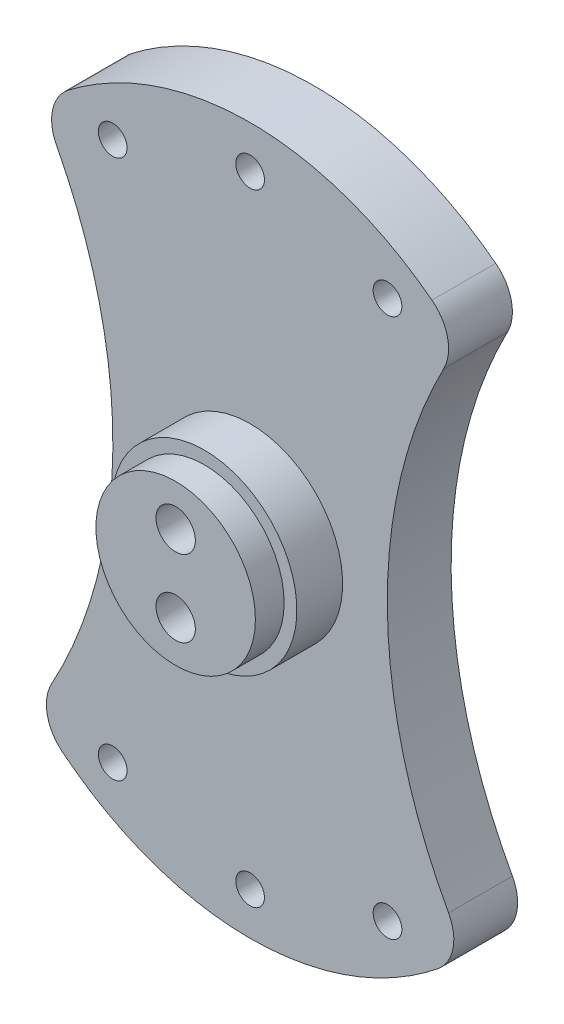
ISO-10303-21;
HEADER;
FILE_DESCRIPTION(('STEP AP214'),'2;1');
FILE_NAME('part.step','',(''),(''),'','','');
FILE_SCHEMA(('AUTOMOTIVE_DESIGN { 1 0 10303 214 1 1 1 1 }'));
ENDSEC;
DATA;
#1=APPLICATION_CONTEXT('core data for automotive mechanical design processes');
#2=APPLICATION_PROTOCOL_DEFINITION('international standard','automotive_design',2000,#1);
#3=PRODUCT_CONTEXT('',#1,'mechanical');
#4=PRODUCT('Part','Part','',(#3));
#5=PRODUCT_RELATED_PRODUCT_CATEGORY('part','',(#4));
#6=PRODUCT_DEFINITION_FORMATION('','',#4);
#7=PRODUCT_DEFINITION_CONTEXT('part definition',#1,'design');
#8=PRODUCT_DEFINITION('design','',#6,#7);
#9=PRODUCT_DEFINITION_SHAPE('','',#8);
#10=(LENGTH_UNIT() NAMED_UNIT(*) SI_UNIT(.MILLI.,.METRE.));
#11=(NAMED_UNIT(*) PLANE_ANGLE_UNIT() SI_UNIT($,.RADIAN.));
#12=(NAMED_UNIT(*) SI_UNIT($,.STERADIAN.) SOLID_ANGLE_UNIT());
#13=UNCERTAINTY_MEASURE_WITH_UNIT(LENGTH_MEASURE(1.E-05),#10,'distance_accuracy_value','');
#14=(GEOMETRIC_REPRESENTATION_CONTEXT(3) GLOBAL_UNCERTAINTY_ASSIGNED_CONTEXT((#13)) GLOBAL_UNIT_ASSIGNED_CONTEXT((#10,
#11,#12)) REPRESENTATION_CONTEXT('',''));
#15=CARTESIAN_POINT('',(0.,0.,0.));
#16=DIRECTION('',(0.,0.,1.));
#17=DIRECTION('',(1.,0.,0.));
#18=AXIS2_PLACEMENT_3D('',#15,#16,#17);
#19=CARTESIAN_POINT('',(0.,0.,6.));
#20=DIRECTION('',(0.,0.,1.));
#21=DIRECTION('',(1.,0.,0.));
#22=AXIS2_PLACEMENT_3D('',#19,#20,#21);
#23=PLANE('',#22);
#24=CARTESIAN_POINT('',(0.,-29.225,6.));
#25=DIRECTION('',(0.,0.,1.));
#26=DIRECTION('',(1.,0.,0.));
#27=AXIS2_PLACEMENT_3D('',#24,#25,#26);
#28=CIRCLE('',#27,1.35);
#29=CARTESIAN_POINT('',(1.35,-29.225,6.));
#30=VERTEX_POINT('',#29);
#31=EDGE_CURVE('E158',#30,#30,#28,.F.);
#32=ORIENTED_EDGE('',*,*,#31,.T.);
#33=EDGE_LOOP('',(#32));
#34=FACE_BOUND('',#33,.T.);
#35=CARTESIAN_POINT('',(12.9215543096716,-25.3599782356168,6.));
#36=DIRECTION('',(0.,0.,1.));
#37=DIRECTION('',(1.,0.,0.));
#38=AXIS2_PLACEMENT_3D('',#35,#36,#37);
#39=CIRCLE('',#38,1.35);
#40=CARTESIAN_POINT('',(14.2715543096716,-25.3599782356168,6.));
#41=VERTEX_POINT('',#40);
#42=EDGE_CURVE('E283',#41,#41,#39,.F.);
#43=ORIENTED_EDGE('',*,*,#42,.T.);
#44=EDGE_LOOP('',(#43));
#45=FACE_BOUND('',#44,.T.);
#46=CARTESIAN_POINT('',(12.9215543096716,25.3599782356168,6.));
#47=DIRECTION('',(0.,0.,1.));
#48=DIRECTION('',(1.,0.,0.));
#49=AXIS2_PLACEMENT_3D('',#46,#47,#48);
#50=CIRCLE('',#49,1.35);
#51=CARTESIAN_POINT('',(14.2715543096716,25.3599782356168,6.));
#52=VERTEX_POINT('',#51);
#53=EDGE_CURVE('E280',#52,#52,#50,.T.);
#54=ORIENTED_EDGE('',*,*,#53,.F.);
#55=EDGE_LOOP('',(#54));
#56=FACE_BOUND('',#55,.T.);
#57=CARTESIAN_POINT('',(0.,29.225,6.));
#58=DIRECTION('',(0.,0.,1.));
#59=DIRECTION('',(1.,0.,0.));
#60=AXIS2_PLACEMENT_3D('',#57,#58,#59);
#61=CIRCLE('',#60,1.35);
#62=CARTESIAN_POINT('',(1.35,29.225,6.));
#63=VERTEX_POINT('',#62);
#64=EDGE_CURVE('E267',#63,#63,#61,.T.);
#65=ORIENTED_EDGE('',*,*,#64,.F.);
#66=EDGE_LOOP('',(#65));
#67=FACE_BOUND('',#66,.T.);
#68=CARTESIAN_POINT('',(-12.9215543096716,-25.3599782356168,6.));
#69=DIRECTION('',(0.,0.,1.));
#70=DIRECTION('',(1.,0.,0.));
#71=AXIS2_PLACEMENT_3D('',#68,#69,#70);
#72=CIRCLE('',#71,1.35);
#73=CARTESIAN_POINT('',(-11.5715543096716,-25.3599782356168,6.));
#74=VERTEX_POINT('',#73);
#75=EDGE_CURVE('E202',#74,#74,#72,.F.);
#76=ORIENTED_EDGE('',*,*,#75,.T.);
#77=EDGE_LOOP('',(#76));
#78=FACE_BOUND('',#77,.T.);
#79=CARTESIAN_POINT('',(-59.6118557648063,0.652562466437344,6.));
#80=DIRECTION('',(0.,0.,1.));
#81=DIRECTION('',(1.,0.,0.));
#82=AXIS2_PLACEMENT_3D('',#79,#80,#81);
#83=CIRCLE('',#82,46.7074816018888);
#84=CARTESIAN_POINT('',(-18.2120138586179,22.2775925874196,6.));
#85=VERTEX_POINT('',#84);
#86=CARTESIAN_POINT('',(-18.6651096763802,-21.8185928745938,6.));
#87=VERTEX_POINT('',#86);
#88=EDGE_CURVE('E191',#85,#87,#83,.F.);
#89=ORIENTED_EDGE('',*,*,#88,.T.);
#90=CARTESIAN_POINT('',(-15.1584555229891,-23.7430087985833,6.));
#91=DIRECTION('',(0.,0.,1.));
#92=DIRECTION('',(1.,0.,0.));
#93=AXIS2_PLACEMENT_3D('',#90,#91,#92);
#94=CIRCLE('',#93,4.);
#95=CARTESIAN_POINT('',(-17.6669110775991,-26.8587191077337,6.));
#96=VERTEX_POINT('',#95);
#97=EDGE_CURVE('E172',#87,#96,#94,.T.);
#98=ORIENTED_EDGE('',*,*,#97,.T.);
#99=CARTESIAN_POINT('',(0.,33.225,6.));
#100=CARTESIAN_POINT('',(-3.89805562644198,33.225,6.));
#101=CARTESIAN_POINT('',(-11.6941668793259,31.5256911473883,6.));
#102=CARTESIAN_POINT('',(-21.6921982617657,24.202827109997,6.));
#103=CARTESIAN_POINT('',(-28.4372058259075,13.1331366522399,6.));
#104=CARTESIAN_POINT('',(-30.8188970870462,0.,6.));
#105=CARTESIAN_POINT('',(-28.4372058259075,-13.1331366522399,6.));
#106=CARTESIAN_POINT('',(-21.6921982617657,-24.202827109997,6.));
#107=CARTESIAN_POINT('',(-11.6941668793259,-31.5256911473883,6.));
#108=CARTESIAN_POINT('',(0.,-34.0746544263059,6.));
#109=CARTESIAN_POINT('',(11.6941668793259,-31.5256911473883,6.));
#110=CARTESIAN_POINT('',(21.6921982617657,-24.202827109997,6.));
#111=CARTESIAN_POINT('',(28.4372058259075,-13.1331366522399,6.));
#112=CARTESIAN_POINT('',(30.8188970870462,0.,6.));
#113=CARTESIAN_POINT('',(28.4372058259075,13.1331366522399,6.));
#114=CARTESIAN_POINT('',(21.6921982617657,24.202827109997,6.));
#115=CARTESIAN_POINT('',(11.694166879326,31.5256911473883,6.));
#116=CARTESIAN_POINT('',(3.89805562644199,33.225,6.));
#117=CARTESIAN_POINT('',(0.,33.225,6.));
#118=B_SPLINE_CURVE_WITH_KNOTS('',3,(#99,#100,#101,#102,#103,#104,#105,#106,#107,#108,#109,#110,
#111,#112,#113,#114,#115,#116,#117),.UNSPECIFIED.,.T.,.F.,(4,1,1,1,1,1,1,1,1,1,1,1,1,1,1,1,4),
(0.,0.392699081698724,0.785398163397448,1.17809724509617,1.5707963267949,1.96349540849362,
2.35619449019234,2.74889357189107,3.14159265358979,3.53429173528852,3.92699081698724,
4.31968989868597,4.71238898038469,5.10508806208341,5.49778714378214,5.89048622548086,
6.28318530717959),.UNSPECIFIED.);
#119=CARTESIAN_POINT('',(17.6669110775945,-26.8587191077375,6.));
#120=VERTEX_POINT('',#119);
#121=EDGE_CURVE('E121',#96,#120,#118,.T.);
#122=ORIENTED_EDGE('',*,*,#121,.T.);
#123=CARTESIAN_POINT('',(15.1584555229887,-23.7430087985836,6.));
#124=DIRECTION('',(0.,0.,1.));
#125=DIRECTION('',(1.,0.,0.));
#126=AXIS2_PLACEMENT_3D('',#123,#124,#125);
#127=CIRCLE('',#126,4.);
#128=CARTESIAN_POINT('',(18.6651096763799,-21.818592874594,6.));
#129=VERTEX_POINT('',#128);
#130=EDGE_CURVE('E170',#120,#129,#127,.T.);
#131=ORIENTED_EDGE('',*,*,#130,.T.);
#132=CARTESIAN_POINT('',(59.6118557648063,0.652562466437344,6.));
#133=DIRECTION('',(0.,0.,1.));
#134=DIRECTION('',(1.,0.,0.));
#135=AXIS2_PLACEMENT_3D('',#132,#133,#134);
#136=CIRCLE('',#135,46.7074816018892);
#137=CARTESIAN_POINT('',(18.2120138586175,22.2775925874199,6.));
#138=VERTEX_POINT('',#137);
#139=EDGE_CURVE('E193',#138,#129,#136,.T.);
#140=ORIENTED_EDGE('',*,*,#139,.F.);
#141=CARTESIAN_POINT('',(14.6665568580402,24.1295468679185,6.));
#142=DIRECTION('',(0.,0.,1.));
#143=DIRECTION('',(1.,0.,0.));
#144=AXIS2_PLACEMENT_3D('',#141,#142,#143);
#145=CIRCLE('',#144,4.);
#146=CARTESIAN_POINT('',(17.1006096224813,27.3037219008864,6.));
#147=VERTEX_POINT('',#146);
#148=EDGE_CURVE('E56',#138,#147,#145,.T.);
#149=ORIENTED_EDGE('',*,*,#148,.T.);
#150=CARTESIAN_POINT('',(-17.1006096224776,27.3037219008892,6.));
#151=VERTEX_POINT('',#150);
#152=EDGE_CURVE('E180',#147,#151,#118,.T.);
#153=ORIENTED_EDGE('',*,*,#152,.T.);
#154=CARTESIAN_POINT('',(-14.6665568580405,24.1295468679182,6.));
#155=DIRECTION('',(0.,0.,1.));
#156=DIRECTION('',(1.,0.,0.));
#157=AXIS2_PLACEMENT_3D('',#154,#155,#156);
#158=CIRCLE('',#157,4.);
#159=EDGE_CURVE('E168',#151,#85,#158,.T.);
#160=ORIENTED_EDGE('',*,*,#159,.T.);
#161=EDGE_LOOP('',(#89,#98,#122,#131,#140,#149,#153,#160));
#162=FACE_BOUND('',#161,.T.);
#163=CARTESIAN_POINT('',(-12.9215543096716,25.3599782356168,6.));
#164=DIRECTION('',(0.,0.,1.));
#165=DIRECTION('',(1.,0.,0.));
#166=AXIS2_PLACEMENT_3D('',#163,#164,#165);
#167=CIRCLE('',#166,1.35);
#168=CARTESIAN_POINT('',(-11.5715543096716,25.3599782356168,6.));
#169=VERTEX_POINT('',#168);
#170=EDGE_CURVE('E157',#169,#169,#167,.T.);
#171=ORIENTED_EDGE('',*,*,#170,.F.);
#172=EDGE_LOOP('',(#171));
#173=FACE_BOUND('',#172,.T.);
#174=CARTESIAN_POINT('',(0.,0.,6.));
#175=DIRECTION('',(0.,0.,1.));
#176=DIRECTION('',(1.,0.,0.));
#177=AXIS2_PLACEMENT_3D('',#174,#175,#176);
#178=CIRCLE('',#177,8.7);
#179=CARTESIAN_POINT('',(-8.7,0.,6.));
#180=VERTEX_POINT('',#179);
#181=EDGE_CURVE('E335',#180,#180,#178,.T.);
#182=ORIENTED_EDGE('',*,*,#181,.F.);
#183=EDGE_LOOP('',(#182));
#184=FACE_BOUND('',#183,.T.);
#185=ADVANCED_FACE('F36',(#34,#45,#56,#67,#78,#162,#173,#184),#23,.T.);
#186=CARTESIAN_POINT('',(-59.6118557648063,0.652562466437344,6.));
#187=DIRECTION('',(0.,0.,-1.));
#188=DIRECTION('',(-1.,0.,0.));
#189=AXIS2_PLACEMENT_3D('',#186,#187,#188);
#190=CYLINDRICAL_SURFACE('',#189,46.7074816018888);
#191=CARTESIAN_POINT('',(-59.6118557648063,0.652562466437344,0.));
#192=DIRECTION('',(0.,0.,1.));
#193=DIRECTION('',(1.,0.,0.));
#194=AXIS2_PLACEMENT_3D('',#191,#192,#193);
#195=CIRCLE('',#194,46.7074816018888);
#196=CARTESIAN_POINT('',(-18.2120138586179,22.2775925874196,0.));
#197=VERTEX_POINT('',#196);
#198=CARTESIAN_POINT('',(-18.6651096763802,-21.8185928745938,0.));
#199=VERTEX_POINT('',#198);
#200=EDGE_CURVE('E129',#197,#199,#195,.F.);
#201=ORIENTED_EDGE('',*,*,#200,.T.);
#202=DIRECTION('',(0.,0.,-1.));
#203=VECTOR('',#202,1.);
#204=CARTESIAN_POINT('',(-18.6651096763802,-21.8185928745938,6.));
#205=LINE('',#204,#203);
#206=EDGE_CURVE('E106',#199,#87,#205,.F.);
#207=ORIENTED_EDGE('',*,*,#206,.T.);
#208=ORIENTED_EDGE('',*,*,#88,.F.);
#209=DIRECTION('',(0.,0.,-1.));
#210=VECTOR('',#209,1.);
#211=CARTESIAN_POINT('',(-18.2120138586179,22.2775925874196,6.));
#212=LINE('',#211,#210);
#213=EDGE_CURVE('E111',#85,#197,#212,.T.);
#214=ORIENTED_EDGE('',*,*,#213,.T.);
#215=EDGE_LOOP('',(#201,#207,#208,#214));
#216=FACE_BOUND('',#215,.T.);
#217=ADVANCED_FACE('F189',(#216),#190,.F.);
#218=DIRECTION('',(0.,0.,-1.));
#219=VECTOR('',#218,1.);
#220=SURFACE_OF_LINEAR_EXTRUSION('',#118,#219);
#221=ORIENTED_EDGE('',*,*,#121,.F.);
#222=DIRECTION('',(0.,0.,-1.));
#223=VECTOR('',#222,1.);
#224=CARTESIAN_POINT('',(-17.6669110775948,-26.8587191077372,6.));
#225=LINE('',#224,#223);
#226=CARTESIAN_POINT('',(-17.6669110775948,-26.8587191077372,0.));
#227=VERTEX_POINT('',#226);
#228=EDGE_CURVE('E105',#96,#227,#225,.T.);
#229=ORIENTED_EDGE('',*,*,#228,.T.);
#230=CARTESIAN_POINT('',(0.,33.225,0.));
#231=CARTESIAN_POINT('',(-3.89805562644198,33.225,0.));
#232=CARTESIAN_POINT('',(-11.6941668793259,31.5256911473883,0.));
#233=CARTESIAN_POINT('',(-21.6921982617657,24.202827109997,0.));
#234=CARTESIAN_POINT('',(-28.4372058259075,13.1331366522399,0.));
#235=CARTESIAN_POINT('',(-30.8188970870462,0.,0.));
#236=CARTESIAN_POINT('',(-28.4372058259075,-13.1331366522399,0.));
#237=CARTESIAN_POINT('',(-21.6921982617657,-24.202827109997,0.));
#238=CARTESIAN_POINT('',(-11.6941668793259,-31.5256911473883,0.));
#239=CARTESIAN_POINT('',(0.,-34.0746544263059,0.));
#240=CARTESIAN_POINT('',(11.6941668793259,-31.5256911473883,0.));
#241=CARTESIAN_POINT('',(21.6921982617657,-24.202827109997,0.));
#242=CARTESIAN_POINT('',(28.4372058259075,-13.1331366522399,0.));
#243=CARTESIAN_POINT('',(30.8188970870462,0.,0.));
#244=CARTESIAN_POINT('',(28.4372058259075,13.1331366522399,0.));
#245=CARTESIAN_POINT('',(21.6921982617657,24.202827109997,0.));
#246=CARTESIAN_POINT('',(11.694166879326,31.5256911473883,0.));
#247=CARTESIAN_POINT('',(3.89805562644199,33.225,0.));
#248=CARTESIAN_POINT('',(0.,33.225,0.));
#249=B_SPLINE_CURVE_WITH_KNOTS('',3,(#230,#231,#232,#233,#234,#235,#236,#237,#238,#239,#240,
#241,#242,#243,#244,#245,#246,#247,#248),.UNSPECIFIED.,.T.,.F.,(4,1,1,1,1,1,1,1,1,1,1,1,1,1,1,1,
4),(0.,0.392699081698724,0.785398163397448,1.17809724509617,1.5707963267949,1.96349540849362,
2.35619449019234,2.74889357189107,3.14159265358979,3.53429173528852,3.92699081698724,
4.31968989868597,4.71238898038469,5.10508806208341,5.49778714378214,5.89048622548086,
6.28318530717959),.UNSPECIFIED.);
#250=CARTESIAN_POINT('',(17.6669110775945,-26.8587191077375,0.));
#251=VERTEX_POINT('',#250);
#252=EDGE_CURVE('E118',#227,#251,#249,.T.);
#253=ORIENTED_EDGE('',*,*,#252,.T.);
#254=DIRECTION('',(0.,0.,-1.));
#255=VECTOR('',#254,1.);
#256=CARTESIAN_POINT('',(17.6669110775945,-26.8587191077375,0.));
#257=LINE('',#256,#255);
#258=EDGE_CURVE('E123',#251,#120,#257,.F.);
#259=ORIENTED_EDGE('',*,*,#258,.T.);
#260=EDGE_LOOP('',(#221,#229,#253,#259));
#261=FACE_BOUND('',#260,.T.);
#262=ADVANCED_FACE('F117',(#261),#220,.F.);
#263=CARTESIAN_POINT('',(59.6118557648063,0.652562466437344,6.));
#264=DIRECTION('',(0.,0.,-1.));
#265=DIRECTION('',(-1.,0.,0.));
#266=AXIS2_PLACEMENT_3D('',#263,#264,#265);
#267=CYLINDRICAL_SURFACE('',#266,46.7074816018892);
#268=ORIENTED_EDGE('',*,*,#139,.T.);
#269=DIRECTION('',(0.,0.,-1.));
#270=VECTOR('',#269,1.);
#271=CARTESIAN_POINT('',(18.6651096763799,-21.818592874594,6.));
#272=LINE('',#271,#270);
#273=CARTESIAN_POINT('',(18.6651096763799,-21.818592874594,0.));
#274=VERTEX_POINT('',#273);
#275=EDGE_CURVE('E176',#129,#274,#272,.T.);
#276=ORIENTED_EDGE('',*,*,#275,.T.);
#277=CARTESIAN_POINT('',(59.6118557648063,0.652562466437344,0.));
#278=DIRECTION('',(0.,0.,1.));
#279=DIRECTION('',(1.,0.,0.));
#280=AXIS2_PLACEMENT_3D('',#277,#278,#279);
#281=CIRCLE('',#280,46.7074816018892);
#282=CARTESIAN_POINT('',(18.2120138586175,22.2775925874199,0.));
#283=VERTEX_POINT('',#282);
#284=EDGE_CURVE('E128',#283,#274,#281,.T.);
#285=ORIENTED_EDGE('',*,*,#284,.F.);
#286=DIRECTION('',(0.,0.,-1.));
#287=VECTOR('',#286,1.);
#288=CARTESIAN_POINT('',(18.2120138586175,22.2775925874199,6.));
#289=LINE('',#288,#287);
#290=EDGE_CURVE('E174',#283,#138,#289,.F.);
#291=ORIENTED_EDGE('',*,*,#290,.T.);
#292=EDGE_LOOP('',(#268,#276,#285,#291));
#293=FACE_BOUND('',#292,.T.);
#294=ADVANCED_FACE('F214',(#293),#267,.F.);
#295=CARTESIAN_POINT('',(12.9215543096716,-25.3599782356168,6.));
#296=DIRECTION('',(0.,0.,-1.));
#297=DIRECTION('',(-1.,0.,0.));
#298=AXIS2_PLACEMENT_3D('',#295,#296,#297);
#299=CYLINDRICAL_SURFACE('',#298,1.35);
#300=ORIENTED_EDGE('',*,*,#42,.F.);
#301=EDGE_LOOP('',(#300));
#302=FACE_BOUND('',#301,.T.);
#303=CARTESIAN_POINT('',(12.9215543096716,-25.3599782356168,0.));
#304=DIRECTION('',(0.,0.,1.));
#305=DIRECTION('',(1.,0.,0.));
#306=AXIS2_PLACEMENT_3D('',#303,#304,#305);
#307=CIRCLE('',#306,1.35);
#308=CARTESIAN_POINT('',(14.2715543096716,-25.3599782356168,0.));
#309=VERTEX_POINT('',#308);
#310=EDGE_CURVE('E151',#309,#309,#307,.F.);
#311=ORIENTED_EDGE('',*,*,#310,.T.);
#312=EDGE_LOOP('',(#311));
#313=FACE_BOUND('',#312,.T.);
#314=ADVANCED_FACE('F217',(#302,#313),#299,.F.);
#315=CARTESIAN_POINT('',(12.9215543096716,25.3599782356168,6.));
#316=DIRECTION('',(0.,0.,-1.));
#317=DIRECTION('',(-1.,0.,0.));
#318=AXIS2_PLACEMENT_3D('',#315,#316,#317);
#319=CYLINDRICAL_SURFACE('',#318,1.35);
#320=ORIENTED_EDGE('',*,*,#53,.T.);
#321=EDGE_LOOP('',(#320));
#322=FACE_BOUND('',#321,.T.);
#323=CARTESIAN_POINT('',(12.9215543096716,25.3599782356168,0.));
#324=DIRECTION('',(0.,0.,1.));
#325=DIRECTION('',(1.,0.,0.));
#326=AXIS2_PLACEMENT_3D('',#323,#324,#325);
#327=CIRCLE('',#326,1.35);
#328=CARTESIAN_POINT('',(14.2715543096716,25.3599782356168,0.));
#329=VERTEX_POINT('',#328);
#330=EDGE_CURVE('E146',#329,#329,#327,.T.);
#331=ORIENTED_EDGE('',*,*,#330,.F.);
#332=EDGE_LOOP('',(#331));
#333=FACE_BOUND('',#332,.T.);
#334=ADVANCED_FACE('F253',(#322,#333),#319,.F.);
#335=CARTESIAN_POINT('',(0.,29.225,6.));
#336=DIRECTION('',(0.,0.,-1.));
#337=DIRECTION('',(-1.,0.,0.));
#338=AXIS2_PLACEMENT_3D('',#335,#336,#337);
#339=CYLINDRICAL_SURFACE('',#338,1.35);
#340=ORIENTED_EDGE('',*,*,#64,.T.);
#341=EDGE_LOOP('',(#340));
#342=FACE_BOUND('',#341,.T.);
#343=CARTESIAN_POINT('',(0.,29.225,0.));
#344=DIRECTION('',(0.,0.,1.));
#345=DIRECTION('',(1.,0.,0.));
#346=AXIS2_PLACEMENT_3D('',#343,#344,#345);
#347=CIRCLE('',#346,1.35);
#348=CARTESIAN_POINT('',(1.35,29.225,0.));
#349=VERTEX_POINT('',#348);
#350=EDGE_CURVE('E141',#349,#349,#347,.T.);
#351=ORIENTED_EDGE('',*,*,#350,.F.);
#352=EDGE_LOOP('',(#351));
#353=FACE_BOUND('',#352,.T.);
#354=ADVANCED_FACE('F256',(#342,#353),#339,.F.);
#355=CARTESIAN_POINT('',(-12.9215543096716,-25.3599782356168,6.));
#356=DIRECTION('',(0.,0.,-1.));
#357=DIRECTION('',(-1.,0.,0.));
#358=AXIS2_PLACEMENT_3D('',#355,#356,#357);
#359=CYLINDRICAL_SURFACE('',#358,1.35);
#360=ORIENTED_EDGE('',*,*,#75,.F.);
#361=EDGE_LOOP('',(#360));
#362=FACE_BOUND('',#361,.T.);
#363=CARTESIAN_POINT('',(-12.9215543096716,-25.3599782356168,0.));
#364=DIRECTION('',(0.,0.,1.));
#365=DIRECTION('',(1.,0.,0.));
#366=AXIS2_PLACEMENT_3D('',#363,#364,#365);
#367=CIRCLE('',#366,1.35);
#368=CARTESIAN_POINT('',(-11.5715543096716,-25.3599782356168,0.));
#369=VERTEX_POINT('',#368);
#370=EDGE_CURVE('E137',#369,#369,#367,.F.);
#371=ORIENTED_EDGE('',*,*,#370,.T.);
#372=EDGE_LOOP('',(#371));
#373=FACE_BOUND('',#372,.T.);
#374=ADVANCED_FACE('F212',(#362,#373),#359,.F.);
#375=CARTESIAN_POINT('',(17.1006096224773,27.3037219008895,0.));
#376=VERTEX_POINT('',#375);
#377=CARTESIAN_POINT('',(-17.1006096224776,27.3037219008892,0.));
#378=VERTEX_POINT('',#377);
#379=EDGE_CURVE('E131',#376,#378,#249,.T.);
#380=ORIENTED_EDGE('',*,*,#379,.T.);
#381=DIRECTION('',(0.,0.,-1.));
#382=VECTOR('',#381,1.);
#383=CARTESIAN_POINT('',(-17.1006096224776,27.3037219008892,0.));
#384=LINE('',#383,#382);
#385=EDGE_CURVE('E11',#378,#151,#384,.F.);
#386=ORIENTED_EDGE('',*,*,#385,.T.);
#387=ORIENTED_EDGE('',*,*,#152,.F.);
#388=DIRECTION('',(0.,0.,-1.));
#389=VECTOR('',#388,1.);
#390=CARTESIAN_POINT('',(17.1006096224773,27.3037219008895,6.));
#391=LINE('',#390,#389);
#392=EDGE_CURVE('E44',#147,#376,#391,.T.);
#393=ORIENTED_EDGE('',*,*,#392,.T.);
#394=EDGE_LOOP('',(#380,#386,#387,#393));
#395=FACE_BOUND('',#394,.T.);
#396=ADVANCED_FACE('F179',(#395),#220,.F.);
#397=CARTESIAN_POINT('',(-12.9215543096716,25.3599782356168,6.));
#398=DIRECTION('',(0.,0.,-1.));
#399=DIRECTION('',(-1.,0.,0.));
#400=AXIS2_PLACEMENT_3D('',#397,#398,#399);
#401=CYLINDRICAL_SURFACE('',#400,1.35);
#402=ORIENTED_EDGE('',*,*,#170,.T.);
#403=EDGE_LOOP('',(#402));
#404=FACE_BOUND('',#403,.T.);
#405=CARTESIAN_POINT('',(-12.9215543096716,25.3599782356168,0.));
#406=DIRECTION('',(0.,0.,1.));
#407=DIRECTION('',(1.,0.,0.));
#408=AXIS2_PLACEMENT_3D('',#405,#406,#407);
#409=CIRCLE('',#408,1.35);
#410=CARTESIAN_POINT('',(-11.5715543096716,25.3599782356168,0.));
#411=VERTEX_POINT('',#410);
#412=EDGE_CURVE('E133',#411,#411,#409,.T.);
#413=ORIENTED_EDGE('',*,*,#412,.F.);
#414=EDGE_LOOP('',(#413));
#415=FACE_BOUND('',#414,.T.);
#416=ADVANCED_FACE('F211',(#404,#415),#401,.F.);
#417=CARTESIAN_POINT('',(0.,-29.225,6.));
#418=DIRECTION('',(0.,0.,-1.));
#419=DIRECTION('',(-1.,0.,0.));
#420=AXIS2_PLACEMENT_3D('',#417,#418,#419);
#421=CYLINDRICAL_SURFACE('',#420,1.35);
#422=ORIENTED_EDGE('',*,*,#31,.F.);
#423=EDGE_LOOP('',(#422));
#424=FACE_BOUND('',#423,.T.);
#425=CARTESIAN_POINT('',(0.,-29.225,0.));
#426=DIRECTION('',(0.,0.,1.));
#427=DIRECTION('',(1.,0.,0.));
#428=AXIS2_PLACEMENT_3D('',#425,#426,#427);
#429=CIRCLE('',#428,1.35);
#430=CARTESIAN_POINT('',(1.35,-29.225,0.));
#431=VERTEX_POINT('',#430);
#432=EDGE_CURVE('E154',#431,#431,#429,.F.);
#433=ORIENTED_EDGE('',*,*,#432,.T.);
#434=EDGE_LOOP('',(#433));
#435=FACE_BOUND('',#434,.T.);
#436=ADVANCED_FACE('F223',(#424,#435),#421,.F.);
#437=CARTESIAN_POINT('',(0.,0.,0.));
#438=DIRECTION('',(0.,0.,1.));
#439=DIRECTION('',(1.,0.,0.));
#440=AXIS2_PLACEMENT_3D('',#437,#438,#439);
#441=PLANE('',#440);
#442=CARTESIAN_POINT('',(-10.,0.,0.));
#443=DIRECTION('',(0.,0.,-1.));
#444=DIRECTION('',(-1.,0.,0.));
#445=AXIS2_PLACEMENT_3D('',#442,#443,#444);
#446=CIRCLE('',#445,2.1);
#447=CARTESIAN_POINT('',(-12.1,0.,0.));
#448=VERTEX_POINT('',#447);
#449=EDGE_CURVE('E330',#448,#448,#446,.T.);
#450=ORIENTED_EDGE('',*,*,#449,.F.);
#451=EDGE_LOOP('',(#450));
#452=FACE_BOUND('',#451,.T.);
#453=CARTESIAN_POINT('',(0.,-10.,0.));
#454=DIRECTION('',(0.,0.,-1.));
#455=DIRECTION('',(-1.,0.,0.));
#456=AXIS2_PLACEMENT_3D('',#453,#454,#455);
#457=CIRCLE('',#456,2.1);
#458=CARTESIAN_POINT('',(-2.1,-10.,0.));
#459=VERTEX_POINT('',#458);
#460=EDGE_CURVE('E324',#459,#459,#457,.T.);
#461=ORIENTED_EDGE('',*,*,#460,.F.);
#462=EDGE_LOOP('',(#461));
#463=FACE_BOUND('',#462,.T.);
#464=CARTESIAN_POINT('',(10.,0.,0.));
#465=DIRECTION('',(0.,0.,-1.));
#466=DIRECTION('',(-1.,0.,0.));
#467=AXIS2_PLACEMENT_3D('',#464,#465,#466);
#468=CIRCLE('',#467,2.1);
#469=CARTESIAN_POINT('',(7.9,0.,0.));
#470=VERTEX_POINT('',#469);
#471=EDGE_CURVE('E318',#470,#470,#468,.T.);
#472=ORIENTED_EDGE('',*,*,#471,.F.);
#473=EDGE_LOOP('',(#472));
#474=FACE_BOUND('',#473,.T.);
#475=CARTESIAN_POINT('',(0.,10.,0.));
#476=DIRECTION('',(0.,0.,-1.));
#477=DIRECTION('',(-1.,0.,0.));
#478=AXIS2_PLACEMENT_3D('',#475,#476,#477);
#479=CIRCLE('',#478,2.1);
#480=CARTESIAN_POINT('',(-2.1,10.,0.));
#481=VERTEX_POINT('',#480);
#482=EDGE_CURVE('E311',#481,#481,#479,.T.);
#483=ORIENTED_EDGE('',*,*,#482,.F.);
#484=EDGE_LOOP('',(#483));
#485=FACE_BOUND('',#484,.T.);
#486=CARTESIAN_POINT('',(0.,3.6,0.));
#487=DIRECTION('',(0.,0.,-1.));
#488=DIRECTION('',(-1.,0.,0.));
#489=AXIS2_PLACEMENT_3D('',#486,#487,#488);
#490=CIRCLE('',#489,1.85);
#491=CARTESIAN_POINT('',(-1.85,3.6,0.));
#492=VERTEX_POINT('',#491);
#493=EDGE_CURVE('E299',#492,#492,#490,.T.);
#494=ORIENTED_EDGE('',*,*,#493,.F.);
#495=EDGE_LOOP('',(#494));
#496=FACE_BOUND('',#495,.T.);
#497=CARTESIAN_POINT('',(0.,-3.6,0.));
#498=DIRECTION('',(0.,0.,-1.));
#499=DIRECTION('',(-1.,0.,0.));
#500=AXIS2_PLACEMENT_3D('',#497,#498,#499);
#501=CIRCLE('',#500,1.85);
#502=CARTESIAN_POINT('',(-1.85,-3.6,0.));
#503=VERTEX_POINT('',#502);
#504=EDGE_CURVE('E302',#503,#503,#501,.T.);
#505=ORIENTED_EDGE('',*,*,#504,.F.);
#506=EDGE_LOOP('',(#505));
#507=FACE_BOUND('',#506,.T.);
#508=ORIENTED_EDGE('',*,*,#412,.T.);
#509=EDGE_LOOP('',(#508));
#510=FACE_BOUND('',#509,.T.);
#511=ORIENTED_EDGE('',*,*,#252,.F.);
#512=CARTESIAN_POINT('',(-15.1584555229891,-23.7430087985833,0.));
#513=DIRECTION('',(0.,0.,1.));
#514=DIRECTION('',(1.,0.,0.));
#515=AXIS2_PLACEMENT_3D('',#512,#513,#514);
#516=CIRCLE('',#515,4.);
#517=EDGE_CURVE('E101',#227,#199,#516,.F.);
#518=ORIENTED_EDGE('',*,*,#517,.T.);
#519=ORIENTED_EDGE('',*,*,#200,.F.);
#520=CARTESIAN_POINT('',(-14.6665568580405,24.1295468679182,0.));
#521=DIRECTION('',(0.,0.,1.));
#522=DIRECTION('',(1.,0.,0.));
#523=AXIS2_PLACEMENT_3D('',#520,#521,#522);
#524=CIRCLE('',#523,4.);
#525=EDGE_CURVE('E161',#197,#378,#524,.F.);
#526=ORIENTED_EDGE('',*,*,#525,.T.);
#527=ORIENTED_EDGE('',*,*,#379,.F.);
#528=CARTESIAN_POINT('',(14.6665568580402,24.1295468679185,0.));
#529=DIRECTION('',(0.,0.,1.));
#530=DIRECTION('',(1.,0.,0.));
#531=AXIS2_PLACEMENT_3D('',#528,#529,#530);
#532=CIRCLE('',#531,4.);
#533=EDGE_CURVE('E122',#376,#283,#532,.F.);
#534=ORIENTED_EDGE('',*,*,#533,.T.);
#535=ORIENTED_EDGE('',*,*,#284,.T.);
#536=CARTESIAN_POINT('',(15.1584555229887,-23.7430087985836,0.));
#537=DIRECTION('',(0.,0.,1.));
#538=DIRECTION('',(1.,0.,0.));
#539=AXIS2_PLACEMENT_3D('',#536,#537,#538);
#540=CIRCLE('',#539,4.);
#541=EDGE_CURVE('E112',#274,#251,#540,.F.);
#542=ORIENTED_EDGE('',*,*,#541,.T.);
#543=EDGE_LOOP('',(#511,#518,#519,#526,#527,#534,#535,#542));
#544=FACE_BOUND('',#543,.T.);
#545=ORIENTED_EDGE('',*,*,#370,.F.);
#546=EDGE_LOOP('',(#545));
#547=FACE_BOUND('',#546,.T.);
#548=ORIENTED_EDGE('',*,*,#350,.T.);
#549=EDGE_LOOP('',(#548));
#550=FACE_BOUND('',#549,.T.);
#551=ORIENTED_EDGE('',*,*,#330,.T.);
#552=EDGE_LOOP('',(#551));
#553=FACE_BOUND('',#552,.T.);
#554=ORIENTED_EDGE('',*,*,#310,.F.);
#555=EDGE_LOOP('',(#554));
#556=FACE_BOUND('',#555,.T.);
#557=ORIENTED_EDGE('',*,*,#432,.F.);
#558=EDGE_LOOP('',(#557));
#559=FACE_BOUND('',#558,.T.);
#560=ADVANCED_FACE('F125',(#452,#463,#474,#485,#496,#507,#510,#544,#547,#550,#553,#556,#559),
#441,.F.);
#561=CARTESIAN_POINT('',(-15.1584555229891,-23.7430087985833,3.));
#562=DIRECTION('',(0.,0.,-1.));
#563=DIRECTION('',(-1.,0.,0.));
#564=AXIS2_PLACEMENT_3D('',#561,#562,#563);
#565=CYLINDRICAL_SURFACE('',#564,4.);
#566=ORIENTED_EDGE('',*,*,#97,.F.);
#567=ORIENTED_EDGE('',*,*,#206,.F.);
#568=ORIENTED_EDGE('',*,*,#517,.F.);
#569=ORIENTED_EDGE('',*,*,#228,.F.);
#570=EDGE_LOOP('',(#566,#567,#568,#569));
#571=FACE_BOUND('',#570,.T.);
#572=ADVANCED_FACE('F104',(#571),#565,.T.);
#573=CARTESIAN_POINT('',(15.1584555229887,-23.7430087985836,3.));
#574=DIRECTION('',(0.,0.,-1.));
#575=DIRECTION('',(-1.,0.,0.));
#576=AXIS2_PLACEMENT_3D('',#573,#574,#575);
#577=CYLINDRICAL_SURFACE('',#576,4.);
#578=ORIENTED_EDGE('',*,*,#130,.F.);
#579=ORIENTED_EDGE('',*,*,#258,.F.);
#580=ORIENTED_EDGE('',*,*,#541,.F.);
#581=ORIENTED_EDGE('',*,*,#275,.F.);
#582=EDGE_LOOP('',(#578,#579,#580,#581));
#583=FACE_BOUND('',#582,.T.);
#584=ADVANCED_FACE('F227',(#583),#577,.T.);
#585=CARTESIAN_POINT('',(-14.6665568580405,24.1295468679182,3.));
#586=DIRECTION('',(0.,0.,-1.));
#587=DIRECTION('',(-1.,0.,0.));
#588=AXIS2_PLACEMENT_3D('',#585,#586,#587);
#589=CYLINDRICAL_SURFACE('',#588,4.);
#590=ORIENTED_EDGE('',*,*,#159,.F.);
#591=ORIENTED_EDGE('',*,*,#385,.F.);
#592=ORIENTED_EDGE('',*,*,#525,.F.);
#593=ORIENTED_EDGE('',*,*,#213,.F.);
#594=EDGE_LOOP('',(#590,#591,#592,#593));
#595=FACE_BOUND('',#594,.T.);
#596=ADVANCED_FACE('F186',(#595),#589,.T.);
#597=CARTESIAN_POINT('',(14.6665568580402,24.1295468679185,3.));
#598=DIRECTION('',(0.,0.,-1.));
#599=DIRECTION('',(-1.,0.,0.));
#600=AXIS2_PLACEMENT_3D('',#597,#598,#599);
#601=CYLINDRICAL_SURFACE('',#600,4.);
#602=ORIENTED_EDGE('',*,*,#148,.F.);
#603=ORIENTED_EDGE('',*,*,#290,.F.);
#604=ORIENTED_EDGE('',*,*,#533,.F.);
#605=ORIENTED_EDGE('',*,*,#392,.F.);
#606=EDGE_LOOP('',(#602,#603,#604,#605));
#607=FACE_BOUND('',#606,.T.);
#608=ADVANCED_FACE('F38',(#607),#601,.T.);
#609=CARTESIAN_POINT('',(0.,0.,13.));
#610=DIRECTION('',(0.,0.,-1.));
#611=DIRECTION('',(-1.,0.,0.));
#612=AXIS2_PLACEMENT_3D('',#609,#610,#611);
#613=CYLINDRICAL_SURFACE('',#612,7.5);
#614=CARTESIAN_POINT('',(0.,0.,10.3));
#615=DIRECTION('',(0.,0.,1.));
#616=DIRECTION('',(1.,0.,0.));
#617=AXIS2_PLACEMENT_3D('',#614,#615,#616);
#618=CIRCLE('',#617,7.5);
#619=CARTESIAN_POINT('',(7.5,0.,10.3));
#620=VERTEX_POINT('',#619);
#621=EDGE_CURVE('E338',#620,#620,#618,.T.);
#622=ORIENTED_EDGE('',*,*,#621,.T.);
#623=EDGE_LOOP('',(#622));
#624=FACE_BOUND('',#623,.T.);
#625=CARTESIAN_POINT('',(0.,0.,13.));
#626=DIRECTION('',(0.,0.,1.));
#627=DIRECTION('',(1.,0.,0.));
#628=AXIS2_PLACEMENT_3D('',#625,#626,#627);
#629=CIRCLE('',#628,7.5);
#630=CARTESIAN_POINT('',(7.5,0.,13.));
#631=VERTEX_POINT('',#630);
#632=EDGE_CURVE('E291',#631,#631,#629,.T.);
#633=ORIENTED_EDGE('',*,*,#632,.F.);
#634=EDGE_LOOP('',(#633));
#635=FACE_BOUND('',#634,.T.);
#636=ADVANCED_FACE('F234',(#624,#635),#613,.T.);
#637=CARTESIAN_POINT('',(0.,0.,13.));
#638=DIRECTION('',(0.,0.,1.));
#639=DIRECTION('',(1.,0.,0.));
#640=AXIS2_PLACEMENT_3D('',#637,#638,#639);
#641=PLANE('',#640);
#642=CARTESIAN_POINT('',(0.,3.6,13.));
#643=DIRECTION('',(0.,0.,-1.));
#644=DIRECTION('',(-1.,0.,0.));
#645=AXIS2_PLACEMENT_3D('',#642,#643,#644);
#646=CIRCLE('',#645,1.85);
#647=CARTESIAN_POINT('',(-1.85,3.6,13.));
#648=VERTEX_POINT('',#647);
#649=EDGE_CURVE('E295',#648,#648,#646,.T.);
#650=ORIENTED_EDGE('',*,*,#649,.T.);
#651=EDGE_LOOP('',(#650));
#652=FACE_BOUND('',#651,.T.);
#653=CARTESIAN_POINT('',(0.,-3.6,13.));
#654=DIRECTION('',(0.,0.,-1.));
#655=DIRECTION('',(-1.,0.,0.));
#656=AXIS2_PLACEMENT_3D('',#653,#654,#655);
#657=CIRCLE('',#656,1.85);
#658=CARTESIAN_POINT('',(-1.85,-3.6,13.));
#659=VERTEX_POINT('',#658);
#660=EDGE_CURVE('E305',#659,#659,#657,.T.);
#661=ORIENTED_EDGE('',*,*,#660,.T.);
#662=EDGE_LOOP('',(#661));
#663=FACE_BOUND('',#662,.T.);
#664=ORIENTED_EDGE('',*,*,#632,.T.);
#665=EDGE_LOOP('',(#664));
#666=FACE_BOUND('',#665,.T.);
#667=ADVANCED_FACE('F395',(#652,#663,#666),#641,.T.);
#668=CARTESIAN_POINT('',(0.,-3.6,13.));
#669=DIRECTION('',(0.,0.,-1.));
#670=DIRECTION('',(-1.,0.,0.));
#671=AXIS2_PLACEMENT_3D('',#668,#669,#670);
#672=CYLINDRICAL_SURFACE('',#671,1.85);
#673=ORIENTED_EDGE('',*,*,#660,.F.);
#674=EDGE_LOOP('',(#673));
#675=FACE_BOUND('',#674,.T.);
#676=ORIENTED_EDGE('',*,*,#504,.T.);
#677=EDGE_LOOP('',(#676));
#678=FACE_BOUND('',#677,.T.);
#679=ADVANCED_FACE('F392',(#675,#678),#672,.F.);
#680=CARTESIAN_POINT('',(0.,3.6,13.));
#681=DIRECTION('',(0.,0.,-1.));
#682=DIRECTION('',(-1.,0.,0.));
#683=AXIS2_PLACEMENT_3D('',#680,#681,#682);
#684=CYLINDRICAL_SURFACE('',#683,1.85);
#685=ORIENTED_EDGE('',*,*,#649,.F.);
#686=EDGE_LOOP('',(#685));
#687=FACE_BOUND('',#686,.T.);
#688=ORIENTED_EDGE('',*,*,#493,.T.);
#689=EDGE_LOOP('',(#688));
#690=FACE_BOUND('',#689,.T.);
#691=ADVANCED_FACE('F388',(#687,#690),#684,.F.);
#692=CARTESIAN_POINT('',(0.,10.,5.));
#693=DIRECTION('',(0.,0.,-1.));
#694=DIRECTION('',(-1.,0.,0.));
#695=AXIS2_PLACEMENT_3D('',#692,#693,#694);
#696=CYLINDRICAL_SURFACE('',#695,2.1);
#697=CARTESIAN_POINT('',(0.,10.,5.));
#698=DIRECTION('',(0.,0.,-1.));
#699=DIRECTION('',(-1.,0.,0.));
#700=AXIS2_PLACEMENT_3D('',#697,#698,#699);
#701=CIRCLE('',#700,2.1);
#702=CARTESIAN_POINT('',(-2.1,10.,5.));
#703=VERTEX_POINT('',#702);
#704=EDGE_CURVE('E314',#703,#703,#701,.T.);
#705=ORIENTED_EDGE('',*,*,#704,.F.);
#706=EDGE_LOOP('',(#705));
#707=FACE_BOUND('',#706,.T.);
#708=ORIENTED_EDGE('',*,*,#482,.T.);
#709=EDGE_LOOP('',(#708));
#710=FACE_BOUND('',#709,.T.);
#711=ADVANCED_FACE('F384',(#707,#710),#696,.F.);
#712=CARTESIAN_POINT('',(0.,10.,5.));
#713=DIRECTION('',(0.,0.,-1.));
#714=DIRECTION('',(-1.,0.,0.));
#715=AXIS2_PLACEMENT_3D('',#712,#713,#714);
#716=PLANE('',#715);
#717=ORIENTED_EDGE('',*,*,#704,.T.);
#718=EDGE_LOOP('',(#717));
#719=FACE_BOUND('',#718,.T.);
#720=ADVANCED_FACE('F380',(#719),#716,.T.);
#721=CARTESIAN_POINT('',(10.,0.,5.));
#722=DIRECTION('',(0.,0.,-1.));
#723=DIRECTION('',(-1.,0.,0.));
#724=AXIS2_PLACEMENT_3D('',#721,#722,#723);
#725=CYLINDRICAL_SURFACE('',#724,2.1);
#726=CARTESIAN_POINT('',(10.,0.,5.));
#727=DIRECTION('',(0.,0.,-1.));
#728=DIRECTION('',(-1.,0.,0.));
#729=AXIS2_PLACEMENT_3D('',#726,#727,#728);
#730=CIRCLE('',#729,2.1);
#731=CARTESIAN_POINT('',(7.9,0.,5.));
#732=VERTEX_POINT('',#731);
#733=EDGE_CURVE('E321',#732,#732,#730,.T.);
#734=ORIENTED_EDGE('',*,*,#733,.F.);
#735=EDGE_LOOP('',(#734));
#736=FACE_BOUND('',#735,.T.);
#737=ORIENTED_EDGE('',*,*,#471,.T.);
#738=EDGE_LOOP('',(#737));
#739=FACE_BOUND('',#738,.T.);
#740=ADVANCED_FACE('F376',(#736,#739),#725,.F.);
#741=CARTESIAN_POINT('',(10.,0.,5.));
#742=DIRECTION('',(0.,0.,-1.));
#743=DIRECTION('',(-1.,0.,0.));
#744=AXIS2_PLACEMENT_3D('',#741,#742,#743);
#745=PLANE('',#744);
#746=ORIENTED_EDGE('',*,*,#733,.T.);
#747=EDGE_LOOP('',(#746));
#748=FACE_BOUND('',#747,.T.);
#749=ADVANCED_FACE('F372',(#748),#745,.T.);
#750=CARTESIAN_POINT('',(0.,-10.,5.));
#751=DIRECTION('',(0.,0.,-1.));
#752=DIRECTION('',(-1.,0.,0.));
#753=AXIS2_PLACEMENT_3D('',#750,#751,#752);
#754=CYLINDRICAL_SURFACE('',#753,2.1);
#755=CARTESIAN_POINT('',(0.,-10.,5.));
#756=DIRECTION('',(0.,0.,-1.));
#757=DIRECTION('',(-1.,0.,0.));
#758=AXIS2_PLACEMENT_3D('',#755,#756,#757);
#759=CIRCLE('',#758,2.1);
#760=CARTESIAN_POINT('',(-2.1,-10.,5.));
#761=VERTEX_POINT('',#760);
#762=EDGE_CURVE('E327',#761,#761,#759,.T.);
#763=ORIENTED_EDGE('',*,*,#762,.F.);
#764=EDGE_LOOP('',(#763));
#765=FACE_BOUND('',#764,.T.);
#766=ORIENTED_EDGE('',*,*,#460,.T.);
#767=EDGE_LOOP('',(#766));
#768=FACE_BOUND('',#767,.T.);
#769=ADVANCED_FACE('F368',(#765,#768),#754,.F.);
#770=CARTESIAN_POINT('',(0.,-10.,5.));
#771=DIRECTION('',(0.,0.,-1.));
#772=DIRECTION('',(-1.,0.,0.));
#773=AXIS2_PLACEMENT_3D('',#770,#771,#772);
#774=PLANE('',#773);
#775=ORIENTED_EDGE('',*,*,#762,.T.);
#776=EDGE_LOOP('',(#775));
#777=FACE_BOUND('',#776,.T.);
#778=ADVANCED_FACE('F364',(#777),#774,.T.);
#779=CARTESIAN_POINT('',(-10.,0.,5.));
#780=DIRECTION('',(0.,0.,-1.));
#781=DIRECTION('',(-1.,0.,0.));
#782=AXIS2_PLACEMENT_3D('',#779,#780,#781);
#783=CYLINDRICAL_SURFACE('',#782,2.1);
#784=CARTESIAN_POINT('',(-10.,0.,5.));
#785=DIRECTION('',(0.,0.,-1.));
#786=DIRECTION('',(-1.,0.,0.));
#787=AXIS2_PLACEMENT_3D('',#784,#785,#786);
#788=CIRCLE('',#787,2.1);
#789=CARTESIAN_POINT('',(-12.1,0.,5.));
#790=VERTEX_POINT('',#789);
#791=EDGE_CURVE('E306',#790,#790,#788,.T.);
#792=ORIENTED_EDGE('',*,*,#791,.F.);
#793=EDGE_LOOP('',(#792));
#794=FACE_BOUND('',#793,.T.);
#795=ORIENTED_EDGE('',*,*,#449,.T.);
#796=EDGE_LOOP('',(#795));
#797=FACE_BOUND('',#796,.T.);
#798=ADVANCED_FACE('F358',(#794,#797),#783,.F.);
#799=CARTESIAN_POINT('',(-10.,0.,5.));
#800=DIRECTION('',(0.,0.,-1.));
#801=DIRECTION('',(-1.,0.,0.));
#802=AXIS2_PLACEMENT_3D('',#799,#800,#801);
#803=PLANE('',#802);
#804=ORIENTED_EDGE('',*,*,#791,.T.);
#805=EDGE_LOOP('',(#804));
#806=FACE_BOUND('',#805,.T.);
#807=ADVANCED_FACE('F349',(#806),#803,.T.);
#808=CARTESIAN_POINT('',(0.,0.,10.3));
#809=DIRECTION('',(0.,0.,1.));
#810=DIRECTION('',(1.,0.,0.));
#811=AXIS2_PLACEMENT_3D('',#808,#809,#810);
#812=PLANE('',#811);
#813=CARTESIAN_POINT('',(0.,0.,10.3));
#814=DIRECTION('',(0.,0.,1.));
#815=DIRECTION('',(1.,0.,0.));
#816=AXIS2_PLACEMENT_3D('',#813,#814,#815);
#817=CIRCLE('',#816,8.7);
#818=CARTESIAN_POINT('',(-8.7,0.,10.3));
#819=VERTEX_POINT('',#818);
#820=EDGE_CURVE('E315',#819,#819,#817,.T.);
#821=ORIENTED_EDGE('',*,*,#820,.T.);
#822=EDGE_LOOP('',(#821));
#823=FACE_BOUND('',#822,.T.);
#824=ORIENTED_EDGE('',*,*,#621,.F.);
#825=EDGE_LOOP('',(#824));
#826=FACE_BOUND('',#825,.T.);
#827=ADVANCED_FACE('F346',(#823,#826),#812,.T.);
#828=CARTESIAN_POINT('',(0.,0.,10.3));
#829=DIRECTION('',(0.,0.,-1.));
#830=DIRECTION('',(-1.,0.,0.));
#831=AXIS2_PLACEMENT_3D('',#828,#829,#830);
#832=CYLINDRICAL_SURFACE('',#831,8.7);
#833=CARTESIAN_POINT('',(-8.7,0.,10.3));
#834=CARTESIAN_POINT('',(-8.7,0.,10.2552083333333));
#835=CARTESIAN_POINT('',(-8.7,0.,10.2104166666667));
#836=CARTESIAN_POINT('',(-8.7,0.,10.1208333333333));
#837=CARTESIAN_POINT('',(-8.7,0.,10.0760416666667));
#838=CARTESIAN_POINT('',(-8.7,0.,9.98645833333333));
#839=CARTESIAN_POINT('',(-8.7,0.,9.94166666666667));
#840=CARTESIAN_POINT('',(-8.7,0.,9.85208333333333));
#841=CARTESIAN_POINT('',(-8.7,0.,9.80729166666667));
#842=CARTESIAN_POINT('',(-8.7,0.,9.71770833333333));
#843=CARTESIAN_POINT('',(-8.7,0.,9.67291666666667));
#844=CARTESIAN_POINT('',(-8.7,0.,9.58333333333333));
#845=CARTESIAN_POINT('',(-8.7,0.,9.53854166666667));
#846=CARTESIAN_POINT('',(-8.7,0.,9.44895833333333));
#847=CARTESIAN_POINT('',(-8.7,0.,9.40416666666667));
#848=CARTESIAN_POINT('',(-8.7,0.,9.31458333333333));
#849=CARTESIAN_POINT('',(-8.7,0.,9.26979166666667));
#850=CARTESIAN_POINT('',(-8.7,0.,9.18020833333333));
#851=CARTESIAN_POINT('',(-8.7,0.,9.13541666666667));
#852=CARTESIAN_POINT('',(-8.7,0.,9.04583333333333));
#853=CARTESIAN_POINT('',(-8.7,0.,9.00104166666667));
#854=CARTESIAN_POINT('',(-8.7,0.,8.91145833333333));
#855=CARTESIAN_POINT('',(-8.7,0.,8.86666666666667));
#856=CARTESIAN_POINT('',(-8.7,0.,8.77708333333333));
#857=CARTESIAN_POINT('',(-8.7,0.,8.73229166666667));
#858=CARTESIAN_POINT('',(-8.7,0.,8.64270833333333));
#859=CARTESIAN_POINT('',(-8.7,0.,8.59791666666666));
#860=CARTESIAN_POINT('',(-8.7,0.,8.50833333333333));
#861=CARTESIAN_POINT('',(-8.7,0.,8.46354166666667));
#862=CARTESIAN_POINT('',(-8.7,0.,8.37395833333333));
#863=CARTESIAN_POINT('',(-8.7,0.,8.32916666666667));
#864=CARTESIAN_POINT('',(-8.7,0.,8.23958333333333));
#865=CARTESIAN_POINT('',(-8.7,0.,8.19479166666667));
#866=CARTESIAN_POINT('',(-8.7,0.,8.10520833333333));
#867=CARTESIAN_POINT('',(-8.7,0.,8.06041666666667));
#868=CARTESIAN_POINT('',(-8.7,0.,7.97083333333333));
#869=CARTESIAN_POINT('',(-8.7,0.,7.92604166666667));
#870=CARTESIAN_POINT('',(-8.7,0.,7.83645833333333));
#871=CARTESIAN_POINT('',(-8.7,0.,7.79166666666667));
#872=CARTESIAN_POINT('',(-8.7,0.,7.70208333333333));
#873=CARTESIAN_POINT('',(-8.7,0.,7.65729166666667));
#874=CARTESIAN_POINT('',(-8.7,0.,7.56770833333333));
#875=CARTESIAN_POINT('',(-8.7,0.,7.52291666666667));
#876=CARTESIAN_POINT('',(-8.7,0.,7.43333333333333));
#877=CARTESIAN_POINT('',(-8.7,0.,7.38854166666667));
#878=CARTESIAN_POINT('',(-8.7,0.,7.29895833333333));
#879=CARTESIAN_POINT('',(-8.7,0.,7.25416666666667));
#880=CARTESIAN_POINT('',(-8.7,0.,7.16458333333333));
#881=CARTESIAN_POINT('',(-8.7,0.,7.11979166666667));
#882=CARTESIAN_POINT('',(-8.7,0.,7.03020833333333));
#883=CARTESIAN_POINT('',(-8.7,0.,6.98541666666667));
#884=CARTESIAN_POINT('',(-8.7,0.,6.89583333333333));
#885=CARTESIAN_POINT('',(-8.7,0.,6.85104166666667));
#886=CARTESIAN_POINT('',(-8.7,0.,6.76145833333333));
#887=CARTESIAN_POINT('',(-8.7,0.,6.71666666666667));
#888=CARTESIAN_POINT('',(-8.7,0.,6.62708333333333));
#889=CARTESIAN_POINT('',(-8.7,0.,6.58229166666667));
#890=CARTESIAN_POINT('',(-8.7,0.,6.49270833333333));
#891=CARTESIAN_POINT('',(-8.7,0.,6.44791666666667));
#892=CARTESIAN_POINT('',(-8.7,0.,6.35833333333333));
#893=CARTESIAN_POINT('',(-8.7,0.,6.31354166666667));
#894=CARTESIAN_POINT('',(-8.7,0.,6.22395833333333));
#895=CARTESIAN_POINT('',(-8.7,0.,6.17916666666667));
#896=CARTESIAN_POINT('',(-8.7,0.,6.08958333333333));
#897=CARTESIAN_POINT('',(-8.7,0.,6.04479166666667));
#898=CARTESIAN_POINT('',(-8.7,0.,6.));
#899=B_SPLINE_CURVE_WITH_KNOTS('',3,(#833,#834,#835,#836,#837,#838,#839,#840,#841,#842,#843,
#844,#845,#846,#847,#848,#849,#850,#851,#852,#853,#854,#855,#856,#857,#858,#859,#860,#861,#862,
#863,#864,#865,#866,#867,#868,#869,#870,#871,#872,#873,#874,#875,#876,#877,#878,#879,#880,#881,
#882,#883,#884,#885,#886,#887,#888,#889,#890,#891,#892,#893,#894,#895,#896,#897,#898),
.UNSPECIFIED.,.F.,.F.,(4,2,2,2,2,2,2,2,2,2,2,2,2,2,2,2,2,2,2,2,2,2,2,2,2,2,2,2,2,2,2,2,4),(0.,
0.134374999999999,0.26875,0.403124999999999,0.5375,0.671874999999999,0.80625,0.940624999999999,
1.075,1.209375,1.34375,1.478125,1.6125,1.746875,1.88125,2.015625,2.15,2.284375,2.41875,2.553125,
2.6875,2.821875,2.95625,3.090625,3.225,3.359375,3.49375,3.628125,3.7625,3.896875,4.03125,
4.165625,4.3),.UNSPECIFIED.);
#900=EDGE_CURVE('BSEAM348',#819,#180,#899,.T.);
#901=ORIENTED_EDGE('',*,*,#820,.F.);
#902=ORIENTED_EDGE('',*,*,#181,.T.);
#903=ORIENTED_EDGE('',*,*,#900,.T.);
#904=ORIENTED_EDGE('',*,*,#900,.F.);
#905=EDGE_LOOP('',(#901,#903,#902,#904));
#906=FACE_BOUND('',#905,.T.);
#907=ADVANCED_FACE('F348',(#906),#832,.T.);
#908=CLOSED_SHELL('',(#185,#217,#262,#294,#314,#334,#354,#374,#396,#416,#436,#560,#572,#584,
#596,#608,#636,#667,#679,#691,#711,#720,#740,#749,#769,#778,#798,#807,#827,#907));
#909=MANIFOLD_SOLID_BREP('B2',#908);
#910=ADVANCED_BREP_SHAPE_REPRESENTATION('',(#18,#909),#14);
#911=SHAPE_DEFINITION_REPRESENTATION(#9,#910);
ENDSEC;
END-ISO-10303-21;
